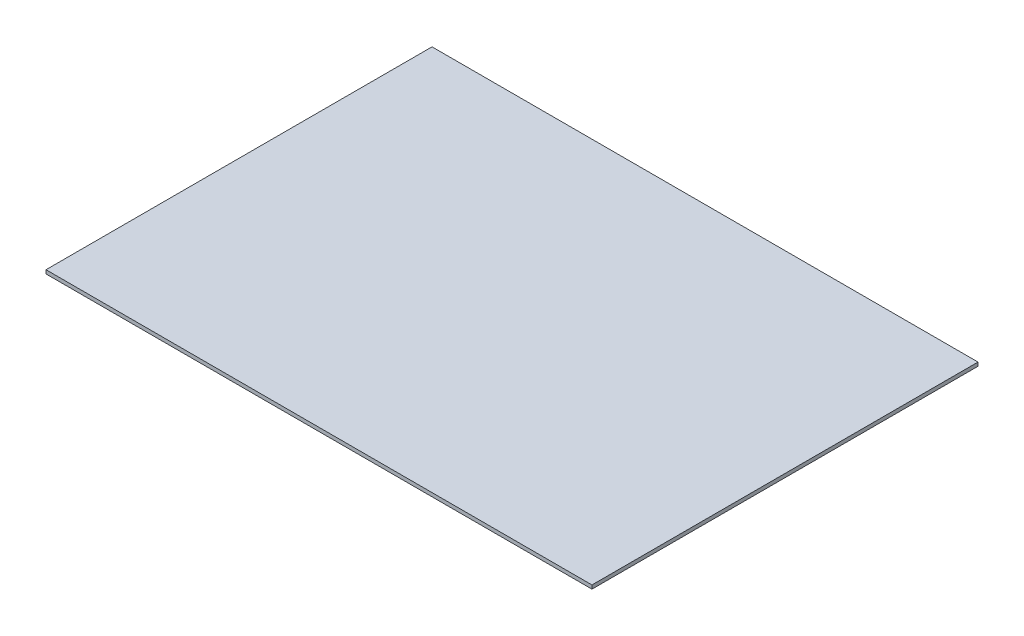
ISO-10303-21;
HEADER;
FILE_DESCRIPTION(('STEP AP214'),'2;1');
FILE_NAME('part.step','',(''),(''),'','','');
FILE_SCHEMA(('AUTOMOTIVE_DESIGN { 1 0 10303 214 1 1 1 1 }'));
ENDSEC;
DATA;
#1=APPLICATION_CONTEXT('core data for automotive mechanical design processes');
#2=APPLICATION_PROTOCOL_DEFINITION('international standard','automotive_design',2000,#1);
#3=PRODUCT_CONTEXT('',#1,'mechanical');
#4=PRODUCT('Part','Part','',(#3));
#5=PRODUCT_RELATED_PRODUCT_CATEGORY('part','',(#4));
#6=PRODUCT_DEFINITION_FORMATION('','',#4);
#7=PRODUCT_DEFINITION_CONTEXT('part definition',#1,'design');
#8=PRODUCT_DEFINITION('design','',#6,#7);
#9=PRODUCT_DEFINITION_SHAPE('','',#8);
#10=(LENGTH_UNIT() NAMED_UNIT(*) SI_UNIT(.MILLI.,.METRE.));
#11=(NAMED_UNIT(*) PLANE_ANGLE_UNIT() SI_UNIT($,.RADIAN.));
#12=(NAMED_UNIT(*) SI_UNIT($,.STERADIAN.) SOLID_ANGLE_UNIT());
#13=UNCERTAINTY_MEASURE_WITH_UNIT(LENGTH_MEASURE(1.E-05),#10,'distance_accuracy_value','');
#14=(GEOMETRIC_REPRESENTATION_CONTEXT(3) GLOBAL_UNCERTAINTY_ASSIGNED_CONTEXT((#13)) GLOBAL_UNIT_ASSIGNED_CONTEXT((#10,
#11,#12)) REPRESENTATION_CONTEXT('',''));
#15=CARTESIAN_POINT('',(0.,0.,0.));
#16=DIRECTION('',(0.,0.,1.));
#17=DIRECTION('',(1.,0.,0.));
#18=AXIS2_PLACEMENT_3D('',#15,#16,#17);
#19=CARTESIAN_POINT('',(-148.5,2.,105.));
#20=DIRECTION('',(-1.,0.,0.));
#21=DIRECTION('',(0.,0.,1.));
#22=AXIS2_PLACEMENT_3D('',#19,#20,#21);
#23=PLANE('',#22);
#24=DIRECTION('',(0.,0.,-1.));
#25=VECTOR('',#24,1.);
#26=CARTESIAN_POINT('',(-148.5,0.,105.));
#27=LINE('',#26,#25);
#28=CARTESIAN_POINT('',(-148.5,0.,105.));
#29=VERTEX_POINT('',#28);
#30=CARTESIAN_POINT('',(-148.5,0.,-105.));
#31=VERTEX_POINT('',#30);
#32=EDGE_CURVE('E116',#29,#31,#27,.T.);
#33=ORIENTED_EDGE('',*,*,#32,.F.);
#34=DIRECTION('',(0.,-1.,0.));
#35=VECTOR('',#34,1.);
#36=CARTESIAN_POINT('',(-148.5,2.,105.));
#37=LINE('',#36,#35);
#38=CARTESIAN_POINT('',(-148.5,2.,105.));
#39=VERTEX_POINT('',#38);
#40=EDGE_CURVE('E11',#39,#29,#37,.T.);
#41=ORIENTED_EDGE('',*,*,#40,.F.);
#42=DIRECTION('',(0.,0.,-1.));
#43=VECTOR('',#42,1.);
#44=CARTESIAN_POINT('',(-148.5,2.,105.));
#45=LINE('',#44,#43);
#46=CARTESIAN_POINT('',(-148.5,2.,-105.));
#47=VERTEX_POINT('',#46);
#48=EDGE_CURVE('E109',#39,#47,#45,.T.);
#49=ORIENTED_EDGE('',*,*,#48,.T.);
#50=DIRECTION('',(0.,-1.,0.));
#51=VECTOR('',#50,1.);
#52=CARTESIAN_POINT('',(-148.5,2.,-105.));
#53=LINE('',#52,#51);
#54=EDGE_CURVE('E48',#47,#31,#53,.T.);
#55=ORIENTED_EDGE('',*,*,#54,.T.);
#56=EDGE_LOOP('',(#33,#41,#49,#55));
#57=FACE_BOUND('',#56,.T.);
#58=ADVANCED_FACE('F45',(#57),#23,.T.);
#59=CARTESIAN_POINT('',(-148.5,2.,105.));
#60=DIRECTION('',(0.,0.,-1.));
#61=DIRECTION('',(-1.,0.,0.));
#62=AXIS2_PLACEMENT_3D('',#59,#60,#61);
#63=PLANE('',#62);
#64=DIRECTION('',(1.,0.,0.));
#65=VECTOR('',#64,1.);
#66=CARTESIAN_POINT('',(-148.5,0.,105.));
#67=LINE('',#66,#65);
#68=CARTESIAN_POINT('',(148.5,0.,105.));
#69=VERTEX_POINT('',#68);
#70=EDGE_CURVE('E79',#29,#69,#67,.T.);
#71=ORIENTED_EDGE('',*,*,#70,.T.);
#72=DIRECTION('',(0.,-1.,0.));
#73=VECTOR('',#72,1.);
#74=CARTESIAN_POINT('',(148.5,2.,105.));
#75=LINE('',#74,#73);
#76=CARTESIAN_POINT('',(148.5,2.,105.));
#77=VERTEX_POINT('',#76);
#78=EDGE_CURVE('E55',#77,#69,#75,.T.);
#79=ORIENTED_EDGE('',*,*,#78,.F.);
#80=DIRECTION('',(1.,0.,0.));
#81=VECTOR('',#80,1.);
#82=CARTESIAN_POINT('',(-148.5,2.,105.));
#83=LINE('',#82,#81);
#84=EDGE_CURVE('E96',#39,#77,#83,.T.);
#85=ORIENTED_EDGE('',*,*,#84,.F.);
#86=ORIENTED_EDGE('',*,*,#40,.T.);
#87=EDGE_LOOP('',(#71,#79,#85,#86));
#88=FACE_BOUND('',#87,.T.);
#89=ADVANCED_FACE('F132',(#88),#63,.F.);
#90=CARTESIAN_POINT('',(148.5,2.,105.));
#91=DIRECTION('',(-1.,0.,0.));
#92=DIRECTION('',(0.,0.,1.));
#93=AXIS2_PLACEMENT_3D('',#90,#91,#92);
#94=PLANE('',#93);
#95=DIRECTION('',(0.,0.,-1.));
#96=VECTOR('',#95,1.);
#97=CARTESIAN_POINT('',(148.5,0.,105.));
#98=LINE('',#97,#96);
#99=CARTESIAN_POINT('',(148.5,0.,-105.));
#100=VERTEX_POINT('',#99);
#101=EDGE_CURVE('E104',#69,#100,#98,.T.);
#102=ORIENTED_EDGE('',*,*,#101,.T.);
#103=DIRECTION('',(0.,-1.,0.));
#104=VECTOR('',#103,1.);
#105=CARTESIAN_POINT('',(148.5,2.,-105.));
#106=LINE('',#105,#104);
#107=CARTESIAN_POINT('',(148.5,2.,-105.));
#108=VERTEX_POINT('',#107);
#109=EDGE_CURVE('E101',#108,#100,#106,.T.);
#110=ORIENTED_EDGE('',*,*,#109,.F.);
#111=DIRECTION('',(0.,0.,-1.));
#112=VECTOR('',#111,1.);
#113=CARTESIAN_POINT('',(148.5,2.,105.));
#114=LINE('',#113,#112);
#115=EDGE_CURVE('E91',#77,#108,#114,.T.);
#116=ORIENTED_EDGE('',*,*,#115,.F.);
#117=ORIENTED_EDGE('',*,*,#78,.T.);
#118=EDGE_LOOP('',(#102,#110,#116,#117));
#119=FACE_BOUND('',#118,.T.);
#120=ADVANCED_FACE('F102',(#119),#94,.F.);
#121=CARTESIAN_POINT('',(-148.5,2.,-105.));
#122=DIRECTION('',(0.,0.,-1.));
#123=DIRECTION('',(-1.,0.,0.));
#124=AXIS2_PLACEMENT_3D('',#121,#122,#123);
#125=PLANE('',#124);
#126=DIRECTION('',(1.,0.,0.));
#127=VECTOR('',#126,1.);
#128=CARTESIAN_POINT('',(-148.5,0.,-105.));
#129=LINE('',#128,#127);
#130=EDGE_CURVE('E120',#31,#100,#129,.T.);
#131=ORIENTED_EDGE('',*,*,#130,.F.);
#132=ORIENTED_EDGE('',*,*,#54,.F.);
#133=DIRECTION('',(1.,0.,0.));
#134=VECTOR('',#133,1.);
#135=CARTESIAN_POINT('',(-148.5,2.,-105.));
#136=LINE('',#135,#134);
#137=EDGE_CURVE('E95',#47,#108,#136,.T.);
#138=ORIENTED_EDGE('',*,*,#137,.T.);
#139=ORIENTED_EDGE('',*,*,#109,.T.);
#140=EDGE_LOOP('',(#131,#132,#138,#139));
#141=FACE_BOUND('',#140,.T.);
#142=ADVANCED_FACE('F107',(#141),#125,.T.);
#143=CARTESIAN_POINT('',(0.,2.,0.));
#144=DIRECTION('',(0.,-1.,0.));
#145=DIRECTION('',(0.,0.,-1.));
#146=AXIS2_PLACEMENT_3D('',#143,#144,#145);
#147=PLANE('',#146);
#148=ORIENTED_EDGE('',*,*,#48,.F.);
#149=ORIENTED_EDGE('',*,*,#84,.T.);
#150=ORIENTED_EDGE('',*,*,#115,.T.);
#151=ORIENTED_EDGE('',*,*,#137,.F.);
#152=EDGE_LOOP('',(#148,#149,#150,#151));
#153=FACE_BOUND('',#152,.T.);
#154=ADVANCED_FACE('F94',(#153),#147,.F.);
#155=CARTESIAN_POINT('',(0.,0.,0.));
#156=DIRECTION('',(0.,-1.,0.));
#157=DIRECTION('',(0.,0.,-1.));
#158=AXIS2_PLACEMENT_3D('',#155,#156,#157);
#159=PLANE('',#158);
#160=ORIENTED_EDGE('',*,*,#32,.T.);
#161=ORIENTED_EDGE('',*,*,#130,.T.);
#162=ORIENTED_EDGE('',*,*,#101,.F.);
#163=ORIENTED_EDGE('',*,*,#70,.F.);
#164=EDGE_LOOP('',(#160,#161,#162,#163));
#165=FACE_BOUND('',#164,.T.);
#166=ADVANCED_FACE('F129',(#165),#159,.T.);
#167=CLOSED_SHELL('',(#58,#89,#120,#142,#154,#166));
#168=MANIFOLD_SOLID_BREP('B2',#167);
#169=ADVANCED_BREP_SHAPE_REPRESENTATION('',(#18,#168),#14);
#170=SHAPE_DEFINITION_REPRESENTATION(#9,#169);
ENDSEC;
END-ISO-10303-21;
